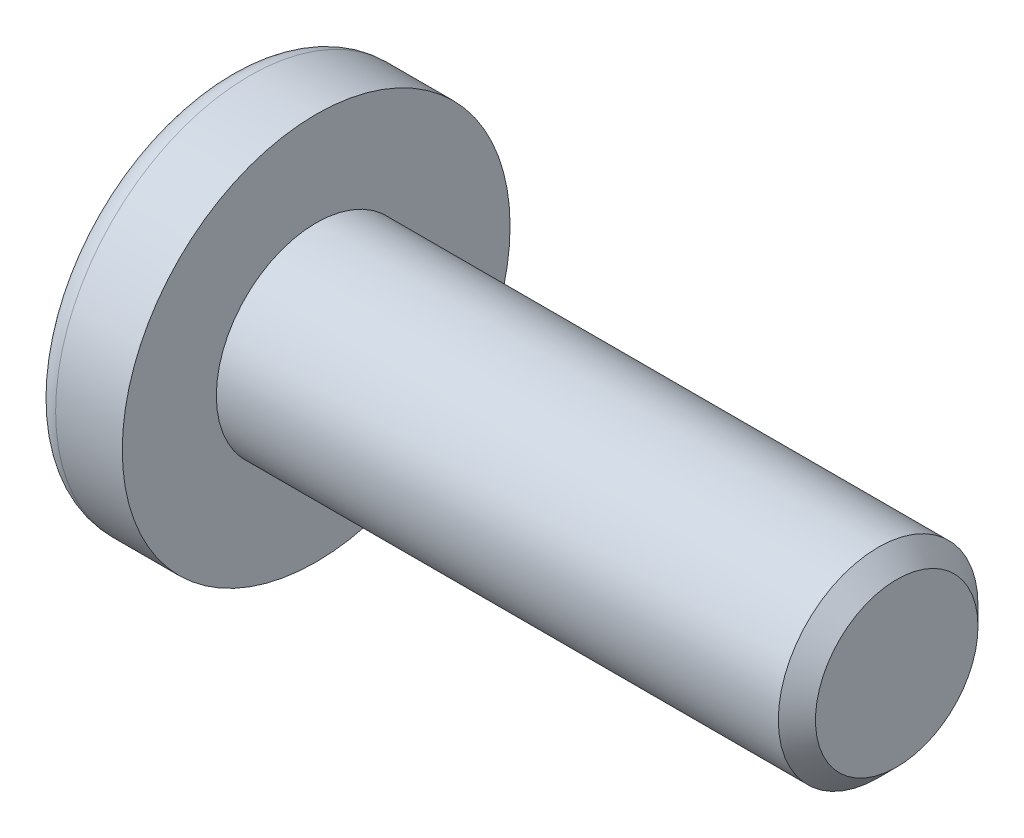
ISO-10303-21;
HEADER;
FILE_DESCRIPTION(('STEP AP214'),'2;1');
FILE_NAME('part.step','',(''),(''),'','','');
FILE_SCHEMA(('AUTOMOTIVE_DESIGN { 1 0 10303 214 1 1 1 1 }'));
ENDSEC;
DATA;
#1=APPLICATION_CONTEXT('core data for automotive mechanical design processes');
#2=APPLICATION_PROTOCOL_DEFINITION('international standard','automotive_design',2000,#1);
#3=PRODUCT_CONTEXT('',#1,'mechanical');
#4=PRODUCT('Part','Part','',(#3));
#5=PRODUCT_RELATED_PRODUCT_CATEGORY('part','',(#4));
#6=PRODUCT_DEFINITION_FORMATION('','',#4);
#7=PRODUCT_DEFINITION_CONTEXT('part definition',#1,'design');
#8=PRODUCT_DEFINITION('design','',#6,#7);
#9=PRODUCT_DEFINITION_SHAPE('','',#8);
#10=(LENGTH_UNIT() NAMED_UNIT(*) SI_UNIT(.MILLI.,.METRE.));
#11=(NAMED_UNIT(*) PLANE_ANGLE_UNIT() SI_UNIT($,.RADIAN.));
#12=(NAMED_UNIT(*) SI_UNIT($,.STERADIAN.) SOLID_ANGLE_UNIT());
#13=UNCERTAINTY_MEASURE_WITH_UNIT(LENGTH_MEASURE(1.E-05),#10,'distance_accuracy_value','');
#14=(GEOMETRIC_REPRESENTATION_CONTEXT(3) GLOBAL_UNCERTAINTY_ASSIGNED_CONTEXT((#13)) GLOBAL_UNIT_ASSIGNED_CONTEXT((#10,
#11,#12)) REPRESENTATION_CONTEXT('',''));
#15=CARTESIAN_POINT('',(0.,0.,0.));
#16=DIRECTION('',(0.,0.,1.));
#17=DIRECTION('',(1.,0.,0.));
#18=AXIS2_PLACEMENT_3D('',#15,#16,#17);
#19=CARTESIAN_POINT('',(3.49504,0.,0.));
#20=DIRECTION('',(-1.,0.,0.));
#21=DIRECTION('',(0.,1.,0.));
#22=AXIS2_PLACEMENT_3D('',#19,#20,#21);
#23=SPHERICAL_SURFACE('',#22,3.49504);
#24=CARTESIAN_POINT('',(0.638066947960321,0.,0.));
#25=DIRECTION('',(-1.,0.,0.));
#26=DIRECTION('',(0.,0.,1.));
#27=AXIS2_PLACEMENT_3D('',#24,#25,#26);
#28=CIRCLE('',#27,2.01320877742947);
#29=CARTESIAN_POINT('',(0.638066947960321,0.,2.01320877742947));
#30=VERTEX_POINT('',#29);
#31=EDGE_CURVE('E157',#30,#30,#28,.T.);
#32=ORIENTED_EDGE('',*,*,#31,.T.);
#33=EDGE_LOOP('',(#32));
#34=FACE_BOUND('',#33,.T.);
#35=CARTESIAN_POINT('',(3.48860800425343,-0.0562204072662827,0.));
#36=DIRECTION('',(-0.113665320353011,-0.99351909641891,0.));
#37=DIRECTION('',(0.99351909641891,-0.113665320353011,0.));
#38=AXIS2_PLACEMENT_3D('',#35,#36,#37);
#39=CIRCLE('',#38,3.49458187725478);
#40=CARTESIAN_POINT('',(0.227775025036725,0.316840992898337,1.19995665346604));
#41=VERTEX_POINT('',#40);
#42=CARTESIAN_POINT('',(0.033060362162214,0.339117670430593,0.339117670430594));
#43=VERTEX_POINT('',#42);
#44=EDGE_CURVE('E267',#41,#43,#39,.T.);
#45=ORIENTED_EDGE('',*,*,#44,.F.);
#46=CARTESIAN_POINT('',(2.78874832810788,0.,-0.872695468934766));
#47=DIRECTION('',(0.629103472698606,0.,0.777321568360582));
#48=DIRECTION('',(0.777321568360582,0.,-0.629103472698606));
#49=AXIS2_PLACEMENT_3D('',#46,#47,#48);
#50=CIRCLE('',#49,3.30981257691679);
#51=CARTESIAN_POINT('',(0.227775025036724,-0.316840992898345,1.19995665346604));
#52=VERTEX_POINT('',#51);
#53=EDGE_CURVE('E156',#41,#52,#50,.T.);
#54=ORIENTED_EDGE('',*,*,#53,.T.);
#55=CARTESIAN_POINT('',(3.48860800425343,0.0562204072662819,0.));
#56=DIRECTION('',(-0.113665320353011,0.99351909641891,0.));
#57=DIRECTION('',(-0.99351909641891,-0.113665320353011,0.));
#58=AXIS2_PLACEMENT_3D('',#55,#56,#57);
#59=CIRCLE('',#58,3.49458187725478);
#60=CARTESIAN_POINT('',(0.0330603621622127,-0.339117670430595,0.339117670430594));
#61=VERTEX_POINT('',#60);
#62=EDGE_CURVE('E112',#61,#52,#59,.T.);
#63=ORIENTED_EDGE('',*,*,#62,.F.);
#64=CARTESIAN_POINT('',(3.48860800425343,0.,-0.056220407266282));
#65=DIRECTION('',(-0.113665320353011,0.,-0.99351909641891));
#66=DIRECTION('',(-0.99351909641891,0.,0.113665320353011));
#67=AXIS2_PLACEMENT_3D('',#64,#65,#66);
#68=CIRCLE('',#67,3.49458187725478);
#69=CARTESIAN_POINT('',(0.227775025036724,-1.19995665346604,0.316840992898341));
#70=VERTEX_POINT('',#69);
#71=EDGE_CURVE('E137',#70,#61,#68,.T.);
#72=ORIENTED_EDGE('',*,*,#71,.F.);
#73=CARTESIAN_POINT('',(2.78874832810788,0.872695468934764,0.));
#74=DIRECTION('',(0.629103472698606,-0.777321568360582,0.));
#75=DIRECTION('',(0.777321568360582,0.629103472698606,0.));
#76=AXIS2_PLACEMENT_3D('',#73,#74,#75);
#77=CIRCLE('',#76,3.30981257691679);
#78=CARTESIAN_POINT('',(0.227775025036722,-1.19995665346604,-0.316840992898341));
#79=VERTEX_POINT('',#78);
#80=EDGE_CURVE('E145',#70,#79,#77,.T.);
#81=ORIENTED_EDGE('',*,*,#80,.T.);
#82=CARTESIAN_POINT('',(3.48860800425343,0.,0.0562204072662826));
#83=DIRECTION('',(-0.113665320353011,0.,0.99351909641891));
#84=DIRECTION('',(0.99351909641891,0.,0.113665320353011));
#85=AXIS2_PLACEMENT_3D('',#82,#83,#84);
#86=CIRCLE('',#85,3.49458187725478);
#87=CARTESIAN_POINT('',(0.0330603621622127,-0.339117670430592,-0.339117670430594));
#88=VERTEX_POINT('',#87);
#89=EDGE_CURVE('E53',#88,#79,#86,.T.);
#90=ORIENTED_EDGE('',*,*,#89,.F.);
#91=CARTESIAN_POINT('',(0.227775025036724,-0.316840992898336,-1.19995665346604));
#92=VERTEX_POINT('',#91);
#93=EDGE_CURVE('E262',#92,#88,#59,.T.);
#94=ORIENTED_EDGE('',*,*,#93,.F.);
#95=CARTESIAN_POINT('',(2.78874832810788,0.,0.872695468934766));
#96=DIRECTION('',(0.629103472698606,0.,-0.777321568360582));
#97=DIRECTION('',(-0.777321568360582,0.,-0.629103472698606));
#98=AXIS2_PLACEMENT_3D('',#95,#96,#97);
#99=CIRCLE('',#98,3.30981257691679);
#100=CARTESIAN_POINT('',(0.227775025036724,0.316840992898345,-1.19995665346604));
#101=VERTEX_POINT('',#100);
#102=EDGE_CURVE('E138',#92,#101,#99,.T.);
#103=ORIENTED_EDGE('',*,*,#102,.T.);
#104=CARTESIAN_POINT('',(0.033060362162214,0.339117670430595,-0.339117670430594));
#105=VERTEX_POINT('',#104);
#106=EDGE_CURVE('E272',#105,#101,#39,.T.);
#107=ORIENTED_EDGE('',*,*,#106,.F.);
#108=CARTESIAN_POINT('',(0.227775025036726,1.19995665346604,-0.316840992898341));
#109=VERTEX_POINT('',#108);
#110=EDGE_CURVE('E173',#109,#105,#86,.T.);
#111=ORIENTED_EDGE('',*,*,#110,.F.);
#112=CARTESIAN_POINT('',(2.78874832810788,-0.872695468934769,0.));
#113=DIRECTION('',(0.629103472698606,0.777321568360582,0.));
#114=DIRECTION('',(-0.777321568360582,0.629103472698606,0.));
#115=AXIS2_PLACEMENT_3D('',#112,#113,#114);
#116=CIRCLE('',#115,3.30981257691679);
#117=CARTESIAN_POINT('',(0.227775025036726,1.19995665346604,0.31684099289834));
#118=VERTEX_POINT('',#117);
#119=EDGE_CURVE('E61',#109,#118,#116,.T.);
#120=ORIENTED_EDGE('',*,*,#119,.T.);
#121=EDGE_CURVE('E171',#43,#118,#68,.T.);
#122=ORIENTED_EDGE('',*,*,#121,.F.);
#123=EDGE_LOOP('',(#45,#54,#63,#72,#81,#90,#94,#103,#107,#111,#120,#122));
#124=FACE_BOUND('',#123,.T.);
#125=ADVANCED_FACE('F38',(#34,#124),#23,.T.);
#126=CARTESIAN_POINT('',(1.71044397905759,0.,-0.147213612565445));
#127=DIRECTION('',(-0.113665320353011,0.,0.99351909641891));
#128=DIRECTION('',(0.99351909641891,0.,0.113665320353011));
#129=AXIS2_PLACEMENT_3D('',#126,#127,#128);
#130=PLANE('',#129);
#131=ORIENTED_EDGE('',*,*,#110,.T.);
#132=DIRECTION('',(0.987162587649563,-0.112938092654823,0.112938092654823));
#133=VECTOR('',#132,1.);
#134=CARTESIAN_POINT('',(1.72685656853982,0.145335901056886,-0.145335901056885));
#135=LINE('',#134,#133);
#136=CARTESIAN_POINT('',(1.4986,0.171450000000001,-0.171449999999999));
#137=VERTEX_POINT('',#136);
#138=EDGE_CURVE('E270',#105,#137,#135,.T.);
#139=ORIENTED_EDGE('',*,*,#138,.T.);
#140=DIRECTION('',(0.774265880811046,-0.626630437436058,0.0885812660249925));
#141=VECTOR('',#140,1.);
#142=CARTESIAN_POINT('',(0.,1.3843,-0.3429));
#143=LINE('',#142,#141);
#144=EDGE_CURVE('E161',#109,#137,#143,.T.);
#145=ORIENTED_EDGE('',*,*,#144,.F.);
#146=EDGE_LOOP('',(#131,#139,#145));
#147=FACE_BOUND('',#146,.T.);
#148=ADVANCED_FACE('F192',(#147),#130,.T.);
#149=DIRECTION('',(0.774265880811046,0.626630437436058,0.0885812660249925));
#150=VECTOR('',#149,1.);
#151=CARTESIAN_POINT('',(0.,-1.3843,-0.3429));
#152=LINE('',#151,#150);
#153=CARTESIAN_POINT('',(1.4986,-0.17145,-0.17145));
#154=VERTEX_POINT('',#153);
#155=EDGE_CURVE('E146',#79,#154,#152,.T.);
#156=ORIENTED_EDGE('',*,*,#155,.T.);
#157=DIRECTION('',(-0.987162587649563,-0.112938092654822,-0.112938092654823));
#158=VECTOR('',#157,1.);
#159=CARTESIAN_POINT('',(1.72685656853982,-0.145335901056885,-0.145335901056885));
#160=LINE('',#159,#158);
#161=EDGE_CURVE('E258',#154,#88,#160,.T.);
#162=ORIENTED_EDGE('',*,*,#161,.T.);
#163=ORIENTED_EDGE('',*,*,#89,.T.);
#164=EDGE_LOOP('',(#156,#162,#163));
#165=FACE_BOUND('',#164,.T.);
#166=ADVANCED_FACE('F198',(#165),#130,.T.);
#167=CARTESIAN_POINT('',(1.71044397905759,0.,0.147213612565445));
#168=DIRECTION('',(-0.113665320353011,0.,-0.99351909641891));
#169=DIRECTION('',(-0.99351909641891,0.,0.113665320353011));
#170=AXIS2_PLACEMENT_3D('',#167,#168,#169);
#171=PLANE('',#170);
#172=DIRECTION('',(0.774265880811046,-0.626630437436058,-0.0885812660249922));
#173=VECTOR('',#172,1.);
#174=CARTESIAN_POINT('',(0.,1.3843,0.342899999999999));
#175=LINE('',#174,#173);
#176=CARTESIAN_POINT('',(1.4986,0.17145,0.17145));
#177=VERTEX_POINT('',#176);
#178=EDGE_CURVE('E251',#118,#177,#175,.T.);
#179=ORIENTED_EDGE('',*,*,#178,.T.);
#180=DIRECTION('',(-0.987162587649563,0.112938092654822,0.112938092654823));
#181=VECTOR('',#180,1.);
#182=CARTESIAN_POINT('',(1.72685656853981,0.145335901056885,0.145335901056886));
#183=LINE('',#182,#181);
#184=EDGE_CURVE('E264',#177,#43,#183,.T.);
#185=ORIENTED_EDGE('',*,*,#184,.T.);
#186=ORIENTED_EDGE('',*,*,#121,.T.);
#187=EDGE_LOOP('',(#179,#185,#186));
#188=FACE_BOUND('',#187,.T.);
#189=ADVANCED_FACE('F221',(#188),#171,.T.);
#190=ORIENTED_EDGE('',*,*,#71,.T.);
#191=DIRECTION('',(0.987162587649563,0.112938092654823,-0.112938092654823));
#192=VECTOR('',#191,1.);
#193=CARTESIAN_POINT('',(1.72685656853982,-0.145335901056886,0.145335901056886));
#194=LINE('',#193,#192);
#195=CARTESIAN_POINT('',(1.4986,-0.171450000000001,0.171449999999999));
#196=VERTEX_POINT('',#195);
#197=EDGE_CURVE('E110',#61,#196,#194,.T.);
#198=ORIENTED_EDGE('',*,*,#197,.T.);
#199=DIRECTION('',(0.774265880811046,0.626630437436058,-0.0885812660249922));
#200=VECTOR('',#199,1.);
#201=CARTESIAN_POINT('',(0.,-1.3843,0.342899999999999));
#202=LINE('',#201,#200);
#203=EDGE_CURVE('E135',#70,#196,#202,.T.);
#204=ORIENTED_EDGE('',*,*,#203,.F.);
#205=EDGE_LOOP('',(#190,#198,#204));
#206=FACE_BOUND('',#205,.T.);
#207=ADVANCED_FACE('F134',(#206),#171,.T.);
#208=CARTESIAN_POINT('',(-25.4,0.,0.));
#209=DIRECTION('',(-1.,0.,0.));
#210=DIRECTION('',(0.,0.,1.));
#211=AXIS2_PLACEMENT_3D('',#208,#209,#210);
#212=CYLINDRICAL_SURFACE('',#211,1.0922);
#213=CARTESIAN_POINT('',(7.7216,0.,0.));
#214=DIRECTION('',(1.,0.,0.));
#215=DIRECTION('',(0.,0.,-1.));
#216=AXIS2_PLACEMENT_3D('',#213,#214,#215);
#217=CIRCLE('',#216,1.0922);
#218=CARTESIAN_POINT('',(7.7216,0.,-1.0922));
#219=VERTEX_POINT('',#218);
#220=EDGE_CURVE('E46',#219,#219,#217,.F.);
#221=ORIENTED_EDGE('',*,*,#220,.T.);
#222=EDGE_LOOP('',(#221));
#223=FACE_BOUND('',#222,.T.);
#224=CARTESIAN_POINT('',(1.5748,0.,0.));
#225=DIRECTION('',(-1.,0.,0.));
#226=DIRECTION('',(0.,0.,1.));
#227=AXIS2_PLACEMENT_3D('',#224,#225,#226);
#228=CIRCLE('',#227,1.0922);
#229=CARTESIAN_POINT('',(1.5748,0.,1.0922));
#230=VERTEX_POINT('',#229);
#231=EDGE_CURVE('E167',#230,#230,#228,.T.);
#232=ORIENTED_EDGE('',*,*,#231,.F.);
#233=EDGE_LOOP('',(#232));
#234=FACE_BOUND('',#233,.T.);
#235=ADVANCED_FACE('F179',(#223,#234),#212,.T.);
#236=CARTESIAN_POINT('',(1.5748,1.0922,0.));
#237=DIRECTION('',(-1.,0.,0.));
#238=DIRECTION('',(0.,0.,1.));
#239=AXIS2_PLACEMENT_3D('',#236,#237,#238);
#240=PLANE('',#239);
#241=CARTESIAN_POINT('',(1.5748,0.,0.));
#242=DIRECTION('',(-1.,0.,0.));
#243=DIRECTION('',(0.,0.,1.));
#244=AXIS2_PLACEMENT_3D('',#241,#242,#243);
#245=CIRCLE('',#244,2.1209);
#246=CARTESIAN_POINT('',(1.5748,0.,2.1209));
#247=VERTEX_POINT('',#246);
#248=EDGE_CURVE('E164',#247,#247,#245,.T.);
#249=ORIENTED_EDGE('',*,*,#248,.F.);
#250=EDGE_LOOP('',(#249));
#251=FACE_BOUND('',#250,.T.);
#252=ORIENTED_EDGE('',*,*,#231,.T.);
#253=EDGE_LOOP('',(#252));
#254=FACE_BOUND('',#253,.T.);
#255=ADVANCED_FACE('F213',(#251,#254),#240,.F.);
#256=CARTESIAN_POINT('',(-25.4,0.,0.));
#257=DIRECTION('',(-1.,0.,0.));
#258=DIRECTION('',(0.,0.,1.));
#259=AXIS2_PLACEMENT_3D('',#256,#257,#258);
#260=CYLINDRICAL_SURFACE('',#259,2.1209);
#261=ORIENTED_EDGE('',*,*,#248,.T.);
#262=EDGE_LOOP('',(#261));
#263=FACE_BOUND('',#262,.T.);
#264=CARTESIAN_POINT('',(0.845695803486458,0.,0.));
#265=DIRECTION('',(-1.,0.,0.));
#266=DIRECTION('',(0.,0.,1.));
#267=AXIS2_PLACEMENT_3D('',#264,#265,#266);
#268=CIRCLE('',#267,2.1209);
#269=CARTESIAN_POINT('',(0.845695803486458,0.,2.1209));
#270=VERTEX_POINT('',#269);
#271=EDGE_CURVE('E160',#270,#270,#268,.T.);
#272=ORIENTED_EDGE('',*,*,#271,.F.);
#273=EDGE_LOOP('',(#272));
#274=FACE_BOUND('',#273,.T.);
#275=ADVANCED_FACE('F209',(#263,#274),#260,.T.);
#276=CARTESIAN_POINT('',(0.845695803486459,0.,0.));
#277=DIRECTION('',(-1.,0.,0.));
#278=DIRECTION('',(0.,0.,1.));
#279=AXIS2_PLACEMENT_3D('',#276,#277,#278);
#280=TOROIDAL_SURFACE('',#279,1.8669,0.254000000000001);
#281=ORIENTED_EDGE('',*,*,#271,.T.);
#282=EDGE_LOOP('',(#281));
#283=FACE_BOUND('',#282,.T.);
#284=ORIENTED_EDGE('',*,*,#31,.F.);
#285=EDGE_LOOP('',(#284));
#286=FACE_BOUND('',#285,.T.);
#287=ADVANCED_FACE('F206',(#283,#286),#280,.T.);
#288=CARTESIAN_POINT('',(7.9248,1.0922,0.));
#289=DIRECTION('',(1.,0.,0.));
#290=DIRECTION('',(0.,0.,-1.));
#291=AXIS2_PLACEMENT_3D('',#288,#289,#290);
#292=PLANE('',#291);
#293=CARTESIAN_POINT('',(7.9248,0.,0.));
#294=DIRECTION('',(1.,0.,0.));
#295=DIRECTION('',(0.,0.,-1.));
#296=AXIS2_PLACEMENT_3D('',#293,#294,#295);
#297=CIRCLE('',#296,0.888999999999997);
#298=CARTESIAN_POINT('',(7.9248,0.,-0.888999999999997));
#299=VERTEX_POINT('',#298);
#300=EDGE_CURVE('E11',#299,#299,#297,.T.);
#301=ORIENTED_EDGE('',*,*,#300,.T.);
#302=EDGE_LOOP('',(#301));
#303=FACE_BOUND('',#302,.T.);
#304=ADVANCED_FACE('F204',(#303),#292,.T.);
#305=CARTESIAN_POINT('',(1.4986,0.17145,0.17145));
#306=DIRECTION('',(0.629103472698606,0.777321568360582,0.));
#307=DIRECTION('',(-0.777321568360582,0.629103472698606,0.));
#308=AXIS2_PLACEMENT_3D('',#305,#306,#307);
#309=PLANE('',#308);
#310=ORIENTED_EDGE('',*,*,#144,.T.);
#311=DIRECTION('',(0.,0.,-1.));
#312=VECTOR('',#311,1.);
#313=CARTESIAN_POINT('',(1.4986,0.17145,0.17145));
#314=LINE('',#313,#312);
#315=EDGE_CURVE('E128',#177,#137,#314,.T.);
#316=ORIENTED_EDGE('',*,*,#315,.F.);
#317=ORIENTED_EDGE('',*,*,#178,.F.);
#318=ORIENTED_EDGE('',*,*,#119,.F.);
#319=EDGE_LOOP('',(#310,#316,#317,#318));
#320=FACE_BOUND('',#319,.T.);
#321=ADVANCED_FACE('F230',(#320),#309,.F.);
#322=CARTESIAN_POINT('',(0.,-1.3843,-0.3429));
#323=DIRECTION('',(0.629103472698606,-0.777321568360582,0.));
#324=DIRECTION('',(0.777321568360582,0.629103472698606,0.));
#325=AXIS2_PLACEMENT_3D('',#322,#323,#324);
#326=PLANE('',#325);
#327=ORIENTED_EDGE('',*,*,#203,.T.);
#328=DIRECTION('',(0.,0.,1.));
#329=VECTOR('',#328,1.);
#330=CARTESIAN_POINT('',(1.4986,-0.17145,-0.17145));
#331=LINE('',#330,#329);
#332=EDGE_CURVE('E127',#154,#196,#331,.T.);
#333=ORIENTED_EDGE('',*,*,#332,.F.);
#334=ORIENTED_EDGE('',*,*,#155,.F.);
#335=ORIENTED_EDGE('',*,*,#80,.F.);
#336=EDGE_LOOP('',(#327,#333,#334,#335));
#337=FACE_BOUND('',#336,.T.);
#338=ADVANCED_FACE('F142',(#337),#326,.F.);
#339=CARTESIAN_POINT('',(1.4986,0.17145,-0.17145));
#340=DIRECTION('',(-1.,0.,0.));
#341=DIRECTION('',(0.,0.,1.));
#342=AXIS2_PLACEMENT_3D('',#339,#340,#341);
#343=PLANE('',#342);
#344=DIRECTION('',(0.,1.,0.));
#345=VECTOR('',#344,1.);
#346=CARTESIAN_POINT('',(1.4986,-0.17145,-0.17145));
#347=LINE('',#346,#345);
#348=EDGE_CURVE('E150',#154,#137,#347,.T.);
#349=ORIENTED_EDGE('',*,*,#348,.F.);
#350=ORIENTED_EDGE('',*,*,#332,.T.);
#351=DIRECTION('',(0.,-1.,0.));
#352=VECTOR('',#351,1.);
#353=CARTESIAN_POINT('',(1.4986,0.17145,0.17145));
#354=LINE('',#353,#352);
#355=EDGE_CURVE('E119',#177,#196,#354,.T.);
#356=ORIENTED_EDGE('',*,*,#355,.F.);
#357=ORIENTED_EDGE('',*,*,#315,.T.);
#358=EDGE_LOOP('',(#349,#350,#356,#357));
#359=FACE_BOUND('',#358,.T.);
#360=ADVANCED_FACE('F148',(#359),#343,.T.);
#361=CARTESIAN_POINT('',(0.,0.342900000000005,-1.3843));
#362=DIRECTION('',(0.629103472698606,0.,-0.777321568360582));
#363=DIRECTION('',(0.777321568360582,0.,0.629103472698606));
#364=AXIS2_PLACEMENT_3D('',#361,#362,#363);
#365=PLANE('',#364);
#366=DIRECTION('',(0.774265880811046,0.08858126602499,0.626630437436058));
#367=VECTOR('',#366,1.);
#368=CARTESIAN_POINT('',(0.,-0.342899999999994,-1.3843));
#369=LINE('',#368,#367);
#370=EDGE_CURVE('E277',#92,#154,#369,.T.);
#371=ORIENTED_EDGE('',*,*,#370,.T.);
#372=ORIENTED_EDGE('',*,*,#348,.T.);
#373=DIRECTION('',(0.774265880811046,-0.0885812660249947,0.626630437436057));
#374=VECTOR('',#373,1.);
#375=CARTESIAN_POINT('',(0.,0.342900000000005,-1.3843));
#376=LINE('',#375,#374);
#377=EDGE_CURVE('E116',#101,#137,#376,.T.);
#378=ORIENTED_EDGE('',*,*,#377,.F.);
#379=ORIENTED_EDGE('',*,*,#102,.F.);
#380=EDGE_LOOP('',(#371,#372,#378,#379));
#381=FACE_BOUND('',#380,.T.);
#382=ADVANCED_FACE('F232',(#381),#365,.F.);
#383=CARTESIAN_POINT('',(1.71044397905759,-0.147213612565445,0.));
#384=DIRECTION('',(-0.113665320353011,0.99351909641891,0.));
#385=DIRECTION('',(-0.99351909641891,-0.113665320353011,0.));
#386=AXIS2_PLACEMENT_3D('',#383,#384,#385);
#387=PLANE('',#386);
#388=ORIENTED_EDGE('',*,*,#93,.T.);
#389=ORIENTED_EDGE('',*,*,#161,.F.);
#390=ORIENTED_EDGE('',*,*,#370,.F.);
#391=EDGE_LOOP('',(#388,#389,#390));
#392=FACE_BOUND('',#391,.T.);
#393=ADVANCED_FACE('F189',(#392),#387,.T.);
#394=CARTESIAN_POINT('',(1.71044397905759,0.147213612565445,0.));
#395=DIRECTION('',(-0.113665320353011,-0.99351909641891,0.));
#396=DIRECTION('',(0.99351909641891,-0.113665320353011,0.));
#397=AXIS2_PLACEMENT_3D('',#394,#395,#396);
#398=PLANE('',#397);
#399=ORIENTED_EDGE('',*,*,#106,.T.);
#400=ORIENTED_EDGE('',*,*,#377,.T.);
#401=ORIENTED_EDGE('',*,*,#138,.F.);
#402=EDGE_LOOP('',(#399,#400,#401));
#403=FACE_BOUND('',#402,.T.);
#404=ADVANCED_FACE('F241',(#403),#398,.T.);
#405=CARTESIAN_POINT('',(1.4986,-0.171450000000001,0.171449999999999));
#406=DIRECTION('',(0.629103472698606,0.,0.777321568360582));
#407=DIRECTION('',(-0.777321568360582,0.,0.629103472698606));
#408=AXIS2_PLACEMENT_3D('',#405,#406,#407);
#409=PLANE('',#408);
#410=DIRECTION('',(0.774265880811046,-0.0885812660249903,-0.626630437436058));
#411=VECTOR('',#410,1.);
#412=CARTESIAN_POINT('',(0.,0.342899999999995,1.3843));
#413=LINE('',#412,#411);
#414=EDGE_CURVE('E115',#41,#177,#413,.T.);
#415=ORIENTED_EDGE('',*,*,#414,.T.);
#416=ORIENTED_EDGE('',*,*,#355,.T.);
#417=DIRECTION('',(0.774265880811046,0.0885812660249944,-0.626630437436058));
#418=VECTOR('',#417,1.);
#419=CARTESIAN_POINT('',(0.,-0.342900000000004,1.3843));
#420=LINE('',#419,#418);
#421=EDGE_CURVE('E106',#52,#196,#420,.T.);
#422=ORIENTED_EDGE('',*,*,#421,.F.);
#423=ORIENTED_EDGE('',*,*,#53,.F.);
#424=EDGE_LOOP('',(#415,#416,#422,#423));
#425=FACE_BOUND('',#424,.T.);
#426=ADVANCED_FACE('F120',(#425),#409,.F.);
#427=ORIENTED_EDGE('',*,*,#44,.T.);
#428=ORIENTED_EDGE('',*,*,#184,.F.);
#429=ORIENTED_EDGE('',*,*,#414,.F.);
#430=EDGE_LOOP('',(#427,#428,#429));
#431=FACE_BOUND('',#430,.T.);
#432=ADVANCED_FACE('F187',(#431),#398,.T.);
#433=ORIENTED_EDGE('',*,*,#62,.T.);
#434=ORIENTED_EDGE('',*,*,#421,.T.);
#435=ORIENTED_EDGE('',*,*,#197,.F.);
#436=EDGE_LOOP('',(#433,#434,#435));
#437=FACE_BOUND('',#436,.T.);
#438=ADVANCED_FACE('F108',(#437),#387,.T.);
#439=CARTESIAN_POINT('',(7.7216,0.,0.));
#440=DIRECTION('',(-1.,0.,0.));
#441=DIRECTION('',(0.,0.,1.));
#442=AXIS2_PLACEMENT_3D('',#439,#440,#441);
#443=CONICAL_SURFACE('',#442,1.0922,0.785398163397455);
#444=ORIENTED_EDGE('',*,*,#300,.F.);
#445=EDGE_LOOP('',(#444));
#446=FACE_BOUND('',#445,.T.);
#447=ORIENTED_EDGE('',*,*,#220,.F.);
#448=EDGE_LOOP('',(#447));
#449=FACE_BOUND('',#448,.T.);
#450=ADVANCED_FACE('F40',(#446,#449),#443,.T.);
#451=CLOSED_SHELL('',(#125,#148,#166,#189,#207,#235,#255,#275,#287,#304,#321,#338,#360,#382,
#393,#404,#426,#432,#438,#450));
#452=MANIFOLD_SOLID_BREP('B2',#451);
#453=ADVANCED_BREP_SHAPE_REPRESENTATION('',(#18,#452),#14);
#454=SHAPE_DEFINITION_REPRESENTATION(#9,#453);
ENDSEC;
END-ISO-10303-21;
